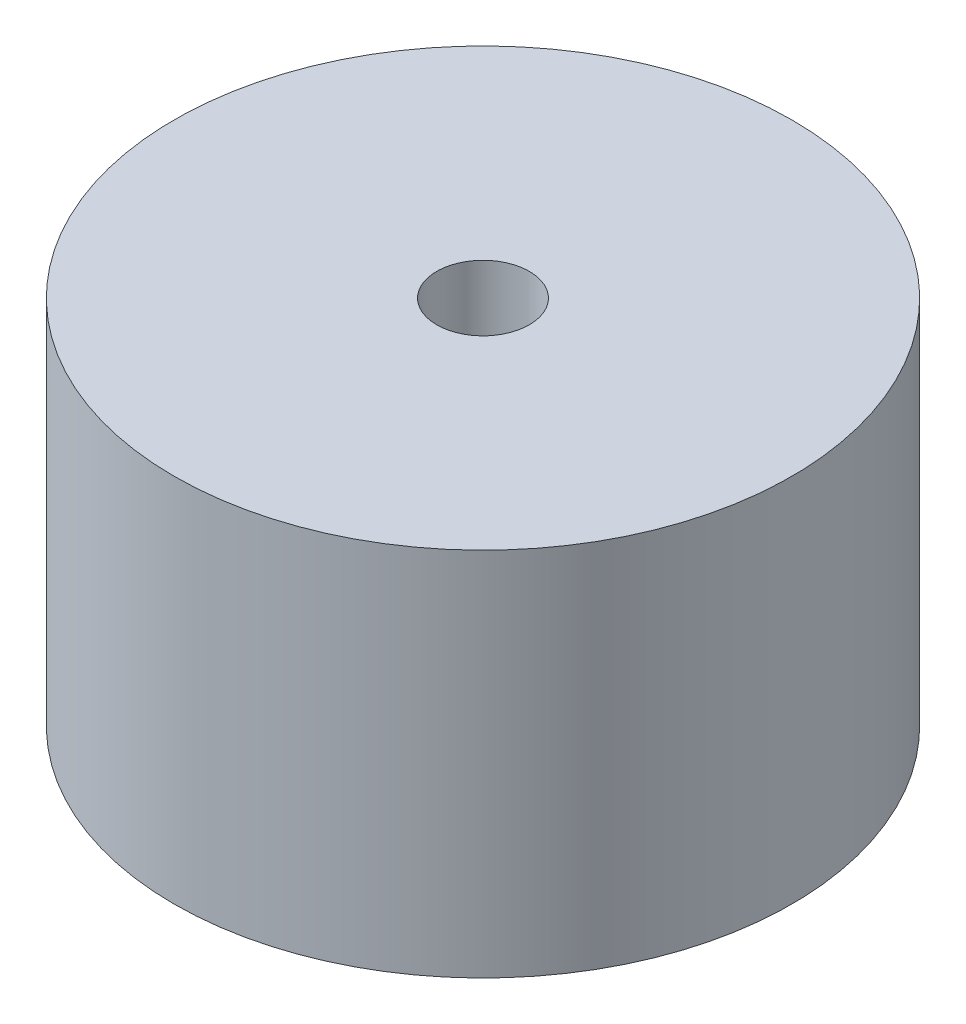
ISO-10303-21;
HEADER;
FILE_DESCRIPTION(('STEP AP214'),'2;1');
FILE_NAME('part.step','',(''),(''),'','','');
FILE_SCHEMA(('AUTOMOTIVE_DESIGN { 1 0 10303 214 1 1 1 1 }'));
ENDSEC;
DATA;
#1=APPLICATION_CONTEXT('core data for automotive mechanical design processes');
#2=APPLICATION_PROTOCOL_DEFINITION('international standard','automotive_design',2000,#1);
#3=PRODUCT_CONTEXT('',#1,'mechanical');
#4=PRODUCT('Part','Part','',(#3));
#5=PRODUCT_RELATED_PRODUCT_CATEGORY('part','',(#4));
#6=PRODUCT_DEFINITION_FORMATION('','',#4);
#7=PRODUCT_DEFINITION_CONTEXT('part definition',#1,'design');
#8=PRODUCT_DEFINITION('design','',#6,#7);
#9=PRODUCT_DEFINITION_SHAPE('','',#8);
#10=(LENGTH_UNIT() NAMED_UNIT(*) SI_UNIT(.MILLI.,.METRE.));
#11=(NAMED_UNIT(*) PLANE_ANGLE_UNIT() SI_UNIT($,.RADIAN.));
#12=(NAMED_UNIT(*) SI_UNIT($,.STERADIAN.) SOLID_ANGLE_UNIT());
#13=UNCERTAINTY_MEASURE_WITH_UNIT(LENGTH_MEASURE(1.E-05),#10,'distance_accuracy_value','');
#14=(GEOMETRIC_REPRESENTATION_CONTEXT(3) GLOBAL_UNCERTAINTY_ASSIGNED_CONTEXT((#13)) GLOBAL_UNIT_ASSIGNED_CONTEXT((#10,
#11,#12)) REPRESENTATION_CONTEXT('',''));
#15=CARTESIAN_POINT('',(0.,0.,0.));
#16=DIRECTION('',(0.,0.,1.));
#17=DIRECTION('',(1.,0.,0.));
#18=AXIS2_PLACEMENT_3D('',#15,#16,#17);
#19=CARTESIAN_POINT('',(0.,12.,0.));
#20=DIRECTION('',(0.,1.,0.));
#21=DIRECTION('',(0.,0.,1.));
#22=AXIS2_PLACEMENT_3D('',#19,#20,#21);
#23=PLANE('',#22);
#24=CARTESIAN_POINT('',(0.,12.,0.));
#25=DIRECTION('',(0.,1.,0.));
#26=DIRECTION('',(0.,0.,1.));
#27=AXIS2_PLACEMENT_3D('',#24,#25,#26);
#28=CIRCLE('',#27,10.);
#29=CARTESIAN_POINT('',(0.,12.,10.));
#30=VERTEX_POINT('',#29);
#31=EDGE_CURVE('E10',#30,#30,#28,.T.);
#32=ORIENTED_EDGE('',*,*,#31,.T.);
#33=EDGE_LOOP('',(#32));
#34=FACE_BOUND('',#33,.T.);
#35=CARTESIAN_POINT('',(0.,12.,0.));
#36=DIRECTION('',(0.,1.,0.));
#37=DIRECTION('',(0.,0.,1.));
#38=AXIS2_PLACEMENT_3D('',#35,#36,#37);
#39=CIRCLE('',#38,1.5);
#40=CARTESIAN_POINT('',(0.,12.,1.5));
#41=VERTEX_POINT('',#40);
#42=EDGE_CURVE('E44',#41,#41,#39,.T.);
#43=ORIENTED_EDGE('',*,*,#42,.F.);
#44=EDGE_LOOP('',(#43));
#45=FACE_BOUND('',#44,.T.);
#46=ADVANCED_FACE('F33',(#34,#45),#23,.T.);
#47=CARTESIAN_POINT('',(0.,0.,0.));
#48=DIRECTION('',(0.,1.,0.));
#49=DIRECTION('',(0.,0.,1.));
#50=AXIS2_PLACEMENT_3D('',#47,#48,#49);
#51=PLANE('',#50);
#52=CARTESIAN_POINT('',(0.,0.,0.));
#53=DIRECTION('',(0.,1.,0.));
#54=DIRECTION('',(0.,0.,1.));
#55=AXIS2_PLACEMENT_3D('',#52,#53,#54);
#56=CIRCLE('',#55,10.);
#57=CARTESIAN_POINT('',(0.,0.,10.));
#58=VERTEX_POINT('',#57);
#59=EDGE_CURVE('E37',#58,#58,#56,.T.);
#60=ORIENTED_EDGE('',*,*,#59,.F.);
#61=EDGE_LOOP('',(#60));
#62=FACE_BOUND('',#61,.T.);
#63=CARTESIAN_POINT('',(0.,0.,0.));
#64=DIRECTION('',(0.,1.,0.));
#65=DIRECTION('',(0.,0.,1.));
#66=AXIS2_PLACEMENT_3D('',#63,#64,#65);
#67=CIRCLE('',#66,1.5);
#68=CARTESIAN_POINT('',(0.,0.,1.5));
#69=VERTEX_POINT('',#68);
#70=EDGE_CURVE('E46',#69,#69,#67,.T.);
#71=ORIENTED_EDGE('',*,*,#70,.T.);
#72=EDGE_LOOP('',(#71));
#73=FACE_BOUND('',#72,.T.);
#74=ADVANCED_FACE('F56',(#62,#73),#51,.F.);
#75=CARTESIAN_POINT('',(0.,12.,0.));
#76=DIRECTION('',(0.,-1.,0.));
#77=DIRECTION('',(0.,0.,-1.));
#78=AXIS2_PLACEMENT_3D('',#75,#76,#77);
#79=CYLINDRICAL_SURFACE('',#78,10.);
#80=ORIENTED_EDGE('',*,*,#31,.F.);
#81=EDGE_LOOP('',(#80));
#82=FACE_BOUND('',#81,.T.);
#83=ORIENTED_EDGE('',*,*,#59,.T.);
#84=EDGE_LOOP('',(#83));
#85=FACE_BOUND('',#84,.T.);
#86=ADVANCED_FACE('F35',(#82,#85),#79,.T.);
#87=CARTESIAN_POINT('',(0.,12.,0.));
#88=DIRECTION('',(0.,-1.,0.));
#89=DIRECTION('',(0.,0.,-1.));
#90=AXIS2_PLACEMENT_3D('',#87,#88,#89);
#91=CYLINDRICAL_SURFACE('',#90,1.5);
#92=ORIENTED_EDGE('',*,*,#42,.T.);
#93=EDGE_LOOP('',(#92));
#94=FACE_BOUND('',#93,.T.);
#95=ORIENTED_EDGE('',*,*,#70,.F.);
#96=EDGE_LOOP('',(#95));
#97=FACE_BOUND('',#96,.T.);
#98=ADVANCED_FACE('F52',(#94,#97),#91,.F.);
#99=CLOSED_SHELL('',(#46,#74,#86,#98));
#100=MANIFOLD_SOLID_BREP('B2',#99);
#101=ADVANCED_BREP_SHAPE_REPRESENTATION('',(#18,#100),#14);
#102=SHAPE_DEFINITION_REPRESENTATION(#9,#101);
ENDSEC;
END-ISO-10303-21;
